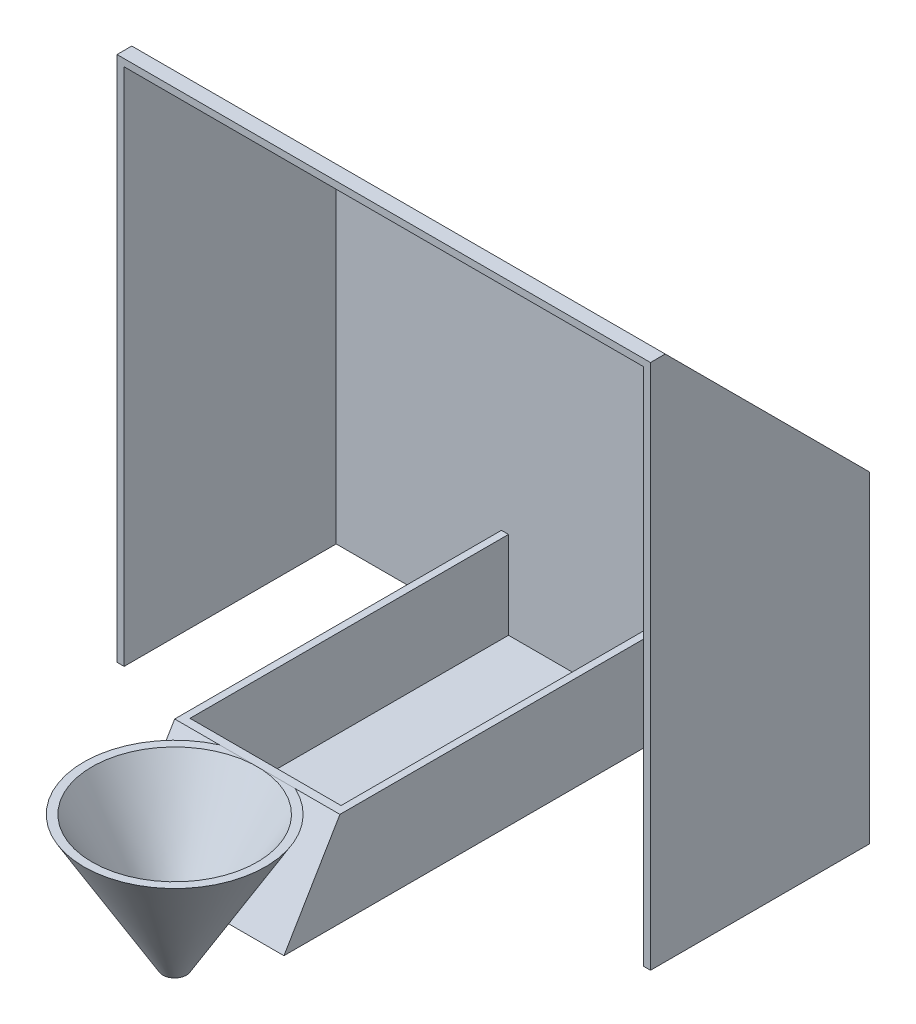
ISO-10303-21;
HEADER;
FILE_DESCRIPTION(('STEP AP214'),'2;1');
FILE_NAME('part.step','',(''),(''),'','','');
FILE_SCHEMA(('AUTOMOTIVE_DESIGN { 1 0 10303 214 1 1 1 1 }'));
ENDSEC;
DATA;
#1=APPLICATION_CONTEXT('core data for automotive mechanical design processes');
#2=APPLICATION_PROTOCOL_DEFINITION('international standard','automotive_design',2000,#1);
#3=PRODUCT_CONTEXT('',#1,'mechanical');
#4=PRODUCT('Part','Part','',(#3));
#5=PRODUCT_RELATED_PRODUCT_CATEGORY('part','',(#4));
#6=PRODUCT_DEFINITION_FORMATION('','',#4);
#7=PRODUCT_DEFINITION_CONTEXT('part definition',#1,'design');
#8=PRODUCT_DEFINITION('design','',#6,#7);
#9=PRODUCT_DEFINITION_SHAPE('','',#8);
#10=(LENGTH_UNIT() NAMED_UNIT(*) SI_UNIT(.MILLI.,.METRE.));
#11=(NAMED_UNIT(*) PLANE_ANGLE_UNIT() SI_UNIT($,.RADIAN.));
#12=(NAMED_UNIT(*) SI_UNIT($,.STERADIAN.) SOLID_ANGLE_UNIT());
#13=UNCERTAINTY_MEASURE_WITH_UNIT(LENGTH_MEASURE(1.E-05),#10,'distance_accuracy_value','');
#14=(GEOMETRIC_REPRESENTATION_CONTEXT(3) GLOBAL_UNCERTAINTY_ASSIGNED_CONTEXT((#13)) GLOBAL_UNIT_ASSIGNED_CONTEXT((#10,
#11,#12)) REPRESENTATION_CONTEXT('',''));
#15=CARTESIAN_POINT('',(0.,0.,0.));
#16=DIRECTION('',(0.,0.,1.));
#17=DIRECTION('',(1.,0.,0.));
#18=AXIS2_PLACEMENT_3D('',#15,#16,#17);
#19=CARTESIAN_POINT('',(105.,-240.579638163115,83.5749702421913));
#20=DIRECTION('',(0.,1.,0.));
#21=DIRECTION('',(0.,0.,1.));
#22=AXIS2_PLACEMENT_3D('',#19,#20,#21);
#23=CONICAL_SURFACE('',#22,2.58073250701614,0.535047974324398);
#24=CARTESIAN_POINT('',(105.,-180.,83.5749702421913));
#25=DIRECTION('',(0.,1.,0.));
#26=DIRECTION('',(0.,0.,1.));
#27=AXIS2_PLACEMENT_3D('',#24,#25,#26);
#28=CIRCLE('',#27,38.4873819644353);
#29=CARTESIAN_POINT('',(105.,-180.,122.062352206627));
#30=VERTEX_POINT('',#29);
#31=EDGE_CURVE('E11',#30,#30,#28,.F.);
#32=CARTESIAN_POINT('',(105.,-236.49798889872,83.5749702421913));
#33=DIRECTION('',(0.,1.,0.));
#34=DIRECTION('',(0.,0.,1.));
#35=AXIS2_PLACEMENT_3D('',#32,#33,#34);
#36=CIRCLE('',#35,5.00000000000001);
#37=CARTESIAN_POINT('',(105.,-236.49798889872,88.5749702421913));
#38=VERTEX_POINT('',#37);
#39=EDGE_CURVE('E62',#38,#38,#36,.T.);
#40=CARTESIAN_POINT('',(105.,-180.,122.062352206627));
#41=CARTESIAN_POINT('',(105.,-180.588520717695,121.713525311164));
#42=CARTESIAN_POINT('',(105.,-181.17704143539,121.364698415701));
#43=CARTESIAN_POINT('',(105.,-182.35408287078,120.667044624775));
#44=CARTESIAN_POINT('',(105.,-182.942603588475,120.318217729312));
#45=CARTESIAN_POINT('',(105.,-184.119645023865,119.620563938386));
#46=CARTESIAN_POINT('',(105.,-184.70816574156,119.271737042924));
#47=CARTESIAN_POINT('',(105.,-185.88520717695,118.574083251998));
#48=CARTESIAN_POINT('',(105.,-186.473727894645,118.225256356535));
#49=CARTESIAN_POINT('',(105.,-187.650769330035,117.527602565609));
#50=CARTESIAN_POINT('',(105.,-188.23929004773,117.178775670146));
#51=CARTESIAN_POINT('',(105.,-189.41633148312,116.481121879221));
#52=CARTESIAN_POINT('',(105.,-190.004852200815,116.132294983758));
#53=CARTESIAN_POINT('',(105.,-191.181893636205,115.434641192832));
#54=CARTESIAN_POINT('',(105.,-191.7704143539,115.085814297369));
#55=CARTESIAN_POINT('',(105.,-192.94745578929,114.388160506443));
#56=CARTESIAN_POINT('',(105.,-193.535976506985,114.039333610981));
#57=CARTESIAN_POINT('',(105.,-194.713017942375,113.341679820055));
#58=CARTESIAN_POINT('',(105.,-195.30153866007,112.992852924592));
#59=CARTESIAN_POINT('',(105.,-196.47858009546,112.295199133666));
#60=CARTESIAN_POINT('',(105.,-197.067100813155,111.946372238203));
#61=CARTESIAN_POINT('',(105.,-198.244142248545,111.248718447278));
#62=CARTESIAN_POINT('',(105.,-198.83266296624,110.899891551815));
#63=CARTESIAN_POINT('',(105.,-200.00970440163,110.202237760889));
#64=CARTESIAN_POINT('',(105.,-200.598225119325,109.853410865426));
#65=CARTESIAN_POINT('',(105.,-201.775266554715,109.1557570745));
#66=CARTESIAN_POINT('',(105.,-202.36378727241,108.806930179038));
#67=CARTESIAN_POINT('',(105.,-203.5408287078,108.109276388112));
#68=CARTESIAN_POINT('',(105.,-204.129349425495,107.760449492649));
#69=CARTESIAN_POINT('',(105.,-205.306390860885,107.062795701723));
#70=CARTESIAN_POINT('',(105.,-205.89491157858,106.71396880626));
#71=CARTESIAN_POINT('',(105.,-207.07195301397,106.016315015335));
#72=CARTESIAN_POINT('',(105.,-207.660473731665,105.667488119872));
#73=CARTESIAN_POINT('',(105.,-208.837515167055,104.969834328946));
#74=CARTESIAN_POINT('',(105.,-209.42603588475,104.621007433483));
#75=CARTESIAN_POINT('',(105.,-210.60307732014,103.923353642557));
#76=CARTESIAN_POINT('',(105.,-211.191598037835,103.574526747095));
#77=CARTESIAN_POINT('',(105.,-212.368639473225,102.876872956169));
#78=CARTESIAN_POINT('',(105.,-212.95716019092,102.528046060706));
#79=CARTESIAN_POINT('',(105.,-214.13420162631,101.83039226978));
#80=CARTESIAN_POINT('',(105.,-214.722722344005,101.481565374317));
#81=CARTESIAN_POINT('',(105.,-215.899763779395,100.783911583392));
#82=CARTESIAN_POINT('',(105.,-216.48828449709,100.435084687929));
#83=CARTESIAN_POINT('',(105.,-217.66532593248,99.737430897003));
#84=CARTESIAN_POINT('',(105.,-218.253846650175,99.3886040015402));
#85=CARTESIAN_POINT('',(105.,-219.430888085565,98.6909502106144));
#86=CARTESIAN_POINT('',(105.,-220.01940880326,98.3421233151516));
#87=CARTESIAN_POINT('',(105.,-221.19645023865,97.6444695242258));
#88=CARTESIAN_POINT('',(105.,-221.784970956345,97.295642628763));
#89=CARTESIAN_POINT('',(105.,-222.962012391735,96.5979888378372));
#90=CARTESIAN_POINT('',(105.,-223.55053310943,96.2491619423744));
#91=CARTESIAN_POINT('',(105.,-224.72757454482,95.5515081514486));
#92=CARTESIAN_POINT('',(105.,-225.316095262515,95.2026812559858));
#93=CARTESIAN_POINT('',(105.,-226.493136697905,94.50502746506));
#94=CARTESIAN_POINT('',(105.,-227.0816574156,94.1562005695972));
#95=CARTESIAN_POINT('',(105.,-228.25869885099,93.4585467786714));
#96=CARTESIAN_POINT('',(105.,-228.847219568685,93.1097198832086));
#97=CARTESIAN_POINT('',(105.,-230.024261004075,92.4120660922828));
#98=CARTESIAN_POINT('',(105.,-230.61278172177,92.0632391968199));
#99=CARTESIAN_POINT('',(105.,-231.78982315716,91.3655854058942));
#100=CARTESIAN_POINT('',(105.,-232.378343874855,91.0167585104314));
#101=CARTESIAN_POINT('',(105.,-233.555385310245,90.3191047195056));
#102=CARTESIAN_POINT('',(105.,-234.14390602794,89.9702778240428));
#103=CARTESIAN_POINT('',(105.,-235.32094746333,89.272624033117));
#104=CARTESIAN_POINT('',(105.,-235.909468181025,88.9237971376541));
#105=CARTESIAN_POINT('',(105.,-236.49798889872,88.5749702421913));
#106=B_SPLINE_CURVE_WITH_KNOTS('',3,(#40,#41,#42,#43,#44,#45,#46,#47,#48,#49,#50,#51,#52,#53,
#54,#55,#56,#57,#58,#59,#60,#61,#62,#63,#64,#65,#66,#67,#68,#69,#70,#71,#72,#73,#74,#75,#76,#77,
#78,#79,#80,#81,#82,#83,#84,#85,#86,#87,#88,#89,#90,#91,#92,#93,#94,#95,#96,#97,#98,#99,#100,
#101,#102,#103,#104,#105),.UNSPECIFIED.,.F.,.F.,(4,2,2,2,2,2,2,2,2,2,2,2,2,2,2,2,2,2,2,2,2,2,2,
2,2,2,2,2,2,2,2,2,4),(0.,2.05239653658609,4.10479307317217,6.15718960975826,8.20958614634434,
10.2619826829304,12.3143792195165,14.3667757561026,16.4191722926886,18.4715688292747,
20.5239653658608,22.5763619024469,24.628758439033,26.681154975619,28.7335515122051,
30.7859480487912,32.8383445853772,34.8907411219633,36.9431376585494,38.9955341951355,
41.0479307317216,43.1003272683077,45.1527238048937,47.2051203414798,49.2575168780659,
51.309913414652,53.3623099512381,55.4147064878241,57.4671030244102,59.5194995609963,
61.5718960975824,63.6242926341685,65.6766891707545),.UNSPECIFIED.);
#107=EDGE_CURVE('BSEAM51',#30,#38,#106,.T.);
#108=ORIENTED_EDGE('',*,*,#31,.T.);
#109=ORIENTED_EDGE('',*,*,#39,.T.);
#110=ORIENTED_EDGE('',*,*,#107,.T.);
#111=ORIENTED_EDGE('',*,*,#107,.F.);
#112=EDGE_LOOP('',(#108,#110,#109,#111));
#113=FACE_BOUND('',#112,.T.);
#114=ADVANCED_FACE('F51',(#113),#23,.T.);
#115=CARTESIAN_POINT('',(105.,-239.04999123417,83.5749702421913));
#116=DIRECTION('',(0.,1.,0.));
#117=DIRECTION('',(0.,0.,1.));
#118=AXIS2_PLACEMENT_3D('',#115,#116,#117);
#119=CONICAL_SURFACE('',#118,0.,0.535047974324398);
#120=CARTESIAN_POINT('',(105.,-180.,83.5749702421913));
#121=DIRECTION('',(0.,-1.,0.));
#122=DIRECTION('',(0.,0.,-1.));
#123=AXIS2_PLACEMENT_3D('',#120,#121,#122);
#124=CIRCLE('',#123,35.);
#125=CARTESIAN_POINT('',(105.,-180.,118.574970242191));
#126=VERTEX_POINT('',#125);
#127=EDGE_CURVE('E58',#126,#126,#124,.T.);
#128=CARTESIAN_POINT('',(105.,-230.614278200717,83.5749702421913));
#129=DIRECTION('',(0.,1.,0.));
#130=DIRECTION('',(0.,0.,1.));
#131=AXIS2_PLACEMENT_3D('',#128,#129,#130);
#132=CIRCLE('',#131,5.00000000000001);
#133=CARTESIAN_POINT('',(105.,-230.614278200717,88.5749702421913));
#134=VERTEX_POINT('',#133);
#135=EDGE_CURVE('E54',#134,#134,#132,.T.);
#136=CARTESIAN_POINT('',(105.,-180.,118.574970242191));
#137=CARTESIAN_POINT('',(105.,-180.527232064591,118.262470242191));
#138=CARTESIAN_POINT('',(105.,-181.054464129182,117.949970242191));
#139=CARTESIAN_POINT('',(105.,-182.108928258363,117.324970242191));
#140=CARTESIAN_POINT('',(105.,-182.636160322954,117.012470242191));
#141=CARTESIAN_POINT('',(105.,-183.690624452136,116.387470242191));
#142=CARTESIAN_POINT('',(105.,-184.217856516726,116.074970242191));
#143=CARTESIAN_POINT('',(105.,-185.272320645908,115.449970242191));
#144=CARTESIAN_POINT('',(105.,-185.799552710499,115.137470242191));
#145=CARTESIAN_POINT('',(105.,-186.85401683968,114.512470242191));
#146=CARTESIAN_POINT('',(105.,-187.381248904271,114.199970242191));
#147=CARTESIAN_POINT('',(105.,-188.435713033453,113.574970242191));
#148=CARTESIAN_POINT('',(105.,-188.962945098044,113.262470242191));
#149=CARTESIAN_POINT('',(105.,-190.017409227225,112.637470242191));
#150=CARTESIAN_POINT('',(105.,-190.544641291816,112.324970242191));
#151=CARTESIAN_POINT('',(105.,-191.599105420998,111.699970242191));
#152=CARTESIAN_POINT('',(105.,-192.126337485588,111.387470242191));
#153=CARTESIAN_POINT('',(105.,-193.18080161477,110.762470242191));
#154=CARTESIAN_POINT('',(105.,-193.708033679361,110.449970242191));
#155=CARTESIAN_POINT('',(105.,-194.762497808542,109.824970242191));
#156=CARTESIAN_POINT('',(105.,-195.289729873133,109.512470242191));
#157=CARTESIAN_POINT('',(105.,-196.344194002315,108.887470242191));
#158=CARTESIAN_POINT('',(105.,-196.871426066906,108.574970242191));
#159=CARTESIAN_POINT('',(105.,-197.925890196087,107.949970242191));
#160=CARTESIAN_POINT('',(105.,-198.453122260678,107.637470242191));
#161=CARTESIAN_POINT('',(105.,-199.50758638986,107.012470242191));
#162=CARTESIAN_POINT('',(105.,-200.034818454451,106.699970242191));
#163=CARTESIAN_POINT('',(105.,-201.089282583632,106.074970242191));
#164=CARTESIAN_POINT('',(105.,-201.616514648223,105.762470242191));
#165=CARTESIAN_POINT('',(105.,-202.670978777405,105.137470242191));
#166=CARTESIAN_POINT('',(105.,-203.198210841995,104.824970242191));
#167=CARTESIAN_POINT('',(105.,-204.252674971177,104.199970242191));
#168=CARTESIAN_POINT('',(105.,-204.779907035768,103.887470242191));
#169=CARTESIAN_POINT('',(105.,-205.834371164949,103.262470242191));
#170=CARTESIAN_POINT('',(105.,-206.36160322954,102.949970242191));
#171=CARTESIAN_POINT('',(105.,-207.416067358722,102.324970242191));
#172=CARTESIAN_POINT('',(105.,-207.943299423313,102.012470242191));
#173=CARTESIAN_POINT('',(105.,-208.997763552494,101.387470242191));
#174=CARTESIAN_POINT('',(105.,-209.524995617085,101.074970242191));
#175=CARTESIAN_POINT('',(105.,-210.579459746267,100.449970242191));
#176=CARTESIAN_POINT('',(105.,-211.106691810857,100.137470242191));
#177=CARTESIAN_POINT('',(105.,-212.161155940039,99.5124702421913));
#178=CARTESIAN_POINT('',(105.,-212.68838800463,99.1999702421913));
#179=CARTESIAN_POINT('',(105.,-213.742852133811,98.5749702421913));
#180=CARTESIAN_POINT('',(105.,-214.270084198402,98.2624702421913));
#181=CARTESIAN_POINT('',(105.,-215.324548327584,97.6374702421913));
#182=CARTESIAN_POINT('',(105.,-215.851780392175,97.3249702421913));
#183=CARTESIAN_POINT('',(105.,-216.906244521356,96.6999702421913));
#184=CARTESIAN_POINT('',(105.,-217.433476585947,96.3874702421913));
#185=CARTESIAN_POINT('',(105.,-218.487940715129,95.7624702421913));
#186=CARTESIAN_POINT('',(105.,-219.015172779719,95.4499702421913));
#187=CARTESIAN_POINT('',(105.,-220.069636908901,94.8249702421913));
#188=CARTESIAN_POINT('',(105.,-220.596868973492,94.5124702421913));
#189=CARTESIAN_POINT('',(105.,-221.651333102674,93.8874702421913));
#190=CARTESIAN_POINT('',(105.,-222.178565167264,93.5749702421913));
#191=CARTESIAN_POINT('',(105.,-223.233029296446,92.9499702421913));
#192=CARTESIAN_POINT('',(105.,-223.760261361037,92.6374702421913));
#193=CARTESIAN_POINT('',(105.,-224.814725490218,92.0124702421913));
#194=CARTESIAN_POINT('',(105.,-225.341957554809,91.6999702421913));
#195=CARTESIAN_POINT('',(105.,-226.396421683991,91.0749702421913));
#196=CARTESIAN_POINT('',(105.,-226.923653748582,90.7624702421913));
#197=CARTESIAN_POINT('',(105.,-227.978117877763,90.1374702421913));
#198=CARTESIAN_POINT('',(105.,-228.505349942354,89.8249702421913));
#199=CARTESIAN_POINT('',(105.,-229.559814071536,89.1999702421913));
#200=CARTESIAN_POINT('',(105.,-230.087046136126,88.8874702421913));
#201=CARTESIAN_POINT('',(105.,-230.614278200717,88.5749702421913));
#202=B_SPLINE_CURVE_WITH_KNOTS('',3,(#136,#137,#138,#139,#140,#141,#142,#143,#144,#145,#146,
#147,#148,#149,#150,#151,#152,#153,#154,#155,#156,#157,#158,#159,#160,#161,#162,#163,#164,#165,
#166,#167,#168,#169,#170,#171,#172,#173,#174,#175,#176,#177,#178,#179,#180,#181,#182,#183,#184,
#185,#186,#187,#188,#189,#190,#191,#192,#193,#194,#195,#196,#197,#198,#199,#200,#201),
.UNSPECIFIED.,.F.,.F.,(4,2,2,2,2,2,2,2,2,2,2,2,2,2,2,2,2,2,2,2,2,2,2,2,2,2,2,2,2,2,2,2,4),(0.,
1.83865959312596,3.67731918625192,5.51597877937788,7.35463837250385,9.19329796562981,
11.0319575587558,12.8706171518817,14.7092767450077,16.5479363381337,18.3865959312596,
20.2252555243856,22.0639151175116,23.9025747106375,25.7412343037635,27.5798938968895,
29.4185534900154,31.2572130831414,33.0958726762673,34.9345322693933,36.7731918625193,
38.6118514556452,40.4505110487712,42.2891706418972,44.1278302350231,45.9664898281491,
47.8051494212751,49.643809014401,51.482468607527,53.321128200653,55.1597877937789,
56.9984473869049,58.8371069800308),.UNSPECIFIED.);
#203=EDGE_CURVE('BSEAM73',#126,#134,#202,.T.);
#204=ORIENTED_EDGE('',*,*,#127,.F.);
#205=ORIENTED_EDGE('',*,*,#135,.F.);
#206=ORIENTED_EDGE('',*,*,#203,.T.);
#207=ORIENTED_EDGE('',*,*,#203,.F.);
#208=EDGE_LOOP('',(#204,#206,#205,#207));
#209=FACE_BOUND('',#208,.T.);
#210=ADVANCED_FACE('F73',(#209),#119,.F.);
#211=CARTESIAN_POINT('',(105.,-180.,48.5749702421913));
#212=DIRECTION('',(0.,1.,0.));
#213=DIRECTION('',(0.,0.,1.));
#214=AXIS2_PLACEMENT_3D('',#211,#212,#213);
#215=PLANE('',#214);
#216=ORIENTED_EDGE('',*,*,#127,.T.);
#217=EDGE_LOOP('',(#216));
#218=FACE_BOUND('',#217,.T.);
#219=ORIENTED_EDGE('',*,*,#31,.F.);
#220=EDGE_LOOP('',(#219));
#221=FACE_BOUND('',#220,.T.);
#222=ADVANCED_FACE('F75',(#218,#221),#215,.T.);
#223=CARTESIAN_POINT('',(105.,-230.,83.5749702421913));
#224=DIRECTION('',(0.,-1.,0.));
#225=DIRECTION('',(0.,0.,-1.));
#226=AXIS2_PLACEMENT_3D('',#223,#224,#225);
#227=CYLINDRICAL_SURFACE('',#226,5.00000000000001);
#228=ORIENTED_EDGE('',*,*,#39,.F.);
#229=EDGE_LOOP('',(#228));
#230=FACE_BOUND('',#229,.T.);
#231=ORIENTED_EDGE('',*,*,#135,.T.);
#232=EDGE_LOOP('',(#231));
#233=FACE_BOUND('',#232,.T.);
#234=ADVANCED_FACE('F71',(#230,#233),#227,.F.);
#235=CLOSED_SHELL('',(#114,#210,#222,#234));
#236=MANIFOLD_SOLID_BREP('B2',#235);
#237=CARTESIAN_POINT('',(140.,-180.,48.5749702421913));
#238=DIRECTION('',(0.,-1.,0.));
#239=DIRECTION('',(0.,0.,-1.));
#240=AXIS2_PLACEMENT_3D('',#237,#238,#239);
#241=PLANE('',#240);
#242=DIRECTION('',(0.,0.,1.));
#243=VECTOR('',#242,1.);
#244=CARTESIAN_POINT('',(73.,-180.,0.));
#245=LINE('',#244,#243);
#246=CARTESIAN_POINT('',(73.,-180.,-89.8528137423856));
#247=VERTEX_POINT('',#246);
#248=CARTESIAN_POINT('',(73.,-180.,45.087588277756));
#249=VERTEX_POINT('',#248);
#250=EDGE_CURVE('E258',#247,#249,#245,.T.);
#251=ORIENTED_EDGE('',*,*,#250,.F.);
#252=DIRECTION('',(1.,0.,0.));
#253=VECTOR('',#252,1.);
#254=CARTESIAN_POINT('',(220.,-180.,-89.8528137423856));
#255=LINE('',#254,#253);
#256=CARTESIAN_POINT('',(70.,-180.,-89.8528137423856));
#257=VERTEX_POINT('',#256);
#258=EDGE_CURVE('E135',#257,#247,#255,.T.);
#259=ORIENTED_EDGE('',*,*,#258,.F.);
#260=DIRECTION('',(0.,0.,1.));
#261=VECTOR('',#260,1.);
#262=CARTESIAN_POINT('',(70.,-180.,48.5749702421913));
#263=LINE('',#262,#261);
#264=CARTESIAN_POINT('',(70.,-180.,48.5749702421913));
#265=VERTEX_POINT('',#264);
#266=EDGE_CURVE('E286',#257,#265,#263,.T.);
#267=ORIENTED_EDGE('',*,*,#266,.T.);
#268=DIRECTION('',(-1.,0.,0.));
#269=VECTOR('',#268,1.);
#270=CARTESIAN_POINT('',(140.,-180.,48.5749702421913));
#271=LINE('',#270,#269);
#272=CARTESIAN_POINT('',(140.,-180.,48.5749702421913));
#273=VERTEX_POINT('',#272);
#274=EDGE_CURVE('E303',#273,#265,#271,.T.);
#275=ORIENTED_EDGE('',*,*,#274,.F.);
#276=DIRECTION('',(0.,0.,1.));
#277=VECTOR('',#276,1.);
#278=CARTESIAN_POINT('',(140.,-180.,48.5749702421913));
#279=LINE('',#278,#277);
#280=CARTESIAN_POINT('',(140.,-180.,-89.8528137423856));
#281=VERTEX_POINT('',#280);
#282=EDGE_CURVE('E287',#281,#273,#279,.T.);
#283=ORIENTED_EDGE('',*,*,#282,.F.);
#284=CARTESIAN_POINT('',(137.,-180.,-89.8528137423856));
#285=VERTEX_POINT('',#284);
#286=EDGE_CURVE('E149',#285,#281,#255,.T.);
#287=ORIENTED_EDGE('',*,*,#286,.F.);
#288=DIRECTION('',(0.,0.,1.));
#289=VECTOR('',#288,1.);
#290=CARTESIAN_POINT('',(137.,-180.,0.));
#291=LINE('',#290,#289);
#292=CARTESIAN_POINT('',(137.,-180.,45.087588277756));
#293=VERTEX_POINT('',#292);
#294=EDGE_CURVE('E272',#285,#293,#291,.T.);
#295=ORIENTED_EDGE('',*,*,#294,.T.);
#296=DIRECTION('',(-1.,0.,0.));
#297=VECTOR('',#296,1.);
#298=CARTESIAN_POINT('',(140.,-180.,45.087588277756));
#299=LINE('',#298,#297);
#300=EDGE_CURVE('E142',#293,#249,#299,.T.);
#301=ORIENTED_EDGE('',*,*,#300,.T.);
#302=EDGE_LOOP('',(#251,#259,#267,#275,#283,#287,#295,#301));
#303=FACE_BOUND('',#302,.T.);
#304=ADVANCED_FACE('F127',(#303),#241,.F.);
#305=CARTESIAN_POINT('',(220.,-220.,-89.8528137423856));
#306=DIRECTION('',(0.,0.,1.));
#307=DIRECTION('',(1.,0.,0.));
#308=AXIS2_PLACEMENT_3D('',#305,#306,#307);
#309=PLANE('',#308);
#310=ORIENTED_EDGE('',*,*,#258,.T.);
#311=DIRECTION('',(0.,-1.,0.));
#312=VECTOR('',#311,1.);
#313=CARTESIAN_POINT('',(73.,-220.,-89.8528137423856));
#314=LINE('',#313,#312);
#315=CARTESIAN_POINT('',(73.,-217.,-89.8528137423856));
#316=VERTEX_POINT('',#315);
#317=EDGE_CURVE('E284',#247,#316,#314,.T.);
#318=ORIENTED_EDGE('',*,*,#317,.T.);
#319=DIRECTION('',(-1.,0.,0.));
#320=VECTOR('',#319,1.);
#321=CARTESIAN_POINT('',(220.,-217.,-89.8528137423856));
#322=LINE('',#321,#320);
#323=CARTESIAN_POINT('',(137.,-217.,-89.8528137423856));
#324=VERTEX_POINT('',#323);
#325=EDGE_CURVE('E271',#324,#316,#322,.T.);
#326=ORIENTED_EDGE('',*,*,#325,.F.);
#327=DIRECTION('',(0.,1.,0.));
#328=VECTOR('',#327,1.);
#329=CARTESIAN_POINT('',(137.,0.,-89.8528137423856));
#330=LINE('',#329,#328);
#331=EDGE_CURVE('E282',#324,#285,#330,.T.);
#332=ORIENTED_EDGE('',*,*,#331,.T.);
#333=ORIENTED_EDGE('',*,*,#286,.T.);
#334=DIRECTION('',(0.,-1.,0.));
#335=VECTOR('',#334,1.);
#336=CARTESIAN_POINT('',(140.,-220.,-89.8528137423856));
#337=LINE('',#336,#335);
#338=CARTESIAN_POINT('',(140.,-220.,-89.8528137423856));
#339=VERTEX_POINT('',#338);
#340=EDGE_CURVE('E49',#281,#339,#337,.T.);
#341=ORIENTED_EDGE('',*,*,#340,.T.);
#342=DIRECTION('',(-1.,0.,0.));
#343=VECTOR('',#342,1.);
#344=CARTESIAN_POINT('',(220.,-220.,-89.8528137423856));
#345=LINE('',#344,#343);
#346=CARTESIAN_POINT('',(220.,-220.,-89.8528137423856));
#347=VERTEX_POINT('',#346);
#348=EDGE_CURVE('E341',#347,#339,#345,.T.);
#349=ORIENTED_EDGE('',*,*,#348,.F.);
#350=DIRECTION('',(0.,1.,0.));
#351=VECTOR('',#350,1.);
#352=CARTESIAN_POINT('',(220.,-220.,-89.8528137423856));
#353=LINE('',#352,#351);
#354=CARTESIAN_POINT('',(220.,-84.8528137423859,-89.8528137423856));
#355=VERTEX_POINT('',#354);
#356=EDGE_CURVE('E310',#347,#355,#353,.T.);
#357=ORIENTED_EDGE('',*,*,#356,.T.);
#358=DIRECTION('',(-1.,0.,0.));
#359=VECTOR('',#358,1.);
#360=CARTESIAN_POINT('',(220.,-84.8528137423859,-89.8528137423856));
#361=LINE('',#360,#359);
#362=CARTESIAN_POINT('',(0.,-84.8528137423859,-89.8528137423856));
#363=VERTEX_POINT('',#362);
#364=EDGE_CURVE('E338',#355,#363,#361,.T.);
#365=ORIENTED_EDGE('',*,*,#364,.T.);
#366=DIRECTION('',(0.,1.,0.));
#367=VECTOR('',#366,1.);
#368=CARTESIAN_POINT('',(0.,-220.,-89.8528137423856));
#369=LINE('',#368,#367);
#370=CARTESIAN_POINT('',(0.,-220.,-89.8528137423856));
#371=VERTEX_POINT('',#370);
#372=EDGE_CURVE('E325',#371,#363,#369,.T.);
#373=ORIENTED_EDGE('',*,*,#372,.F.);
#374=CARTESIAN_POINT('',(70.,-220.,-89.8528137423856));
#375=VERTEX_POINT('',#374);
#376=EDGE_CURVE('E340',#375,#371,#345,.T.);
#377=ORIENTED_EDGE('',*,*,#376,.F.);
#378=DIRECTION('',(0.,-1.,0.));
#379=VECTOR('',#378,1.);
#380=CARTESIAN_POINT('',(70.,-220.,-89.8528137423856));
#381=LINE('',#380,#379);
#382=EDGE_CURVE('E376',#257,#375,#381,.T.);
#383=ORIENTED_EDGE('',*,*,#382,.F.);
#384=EDGE_LOOP('',(#310,#318,#326,#332,#333,#341,#349,#357,#365,#373,#377,#383));
#385=FACE_BOUND('',#384,.T.);
#386=ADVANCED_FACE('F388',(#385),#309,.T.);
#387=CARTESIAN_POINT('',(220.,-220.,0.));
#388=DIRECTION('',(0.,1.,0.));
#389=DIRECTION('',(0.,0.,1.));
#390=AXIS2_PLACEMENT_3D('',#387,#388,#389);
#391=PLANE('',#390);
#392=CARTESIAN_POINT('',(105.,-220.,36.7021527435766));
#393=DIRECTION('',(0.,1.,0.));
#394=DIRECTION('',(0.,0.,1.));
#395=AXIS2_PLACEMENT_3D('',#392,#393,#394);
#396=CIRCLE('',#395,3.6);
#397=CARTESIAN_POINT('',(105.,-220.,40.3021527435766));
#398=VERTEX_POINT('',#397);
#399=EDGE_CURVE('E280',#398,#398,#396,.T.);
#400=ORIENTED_EDGE('',*,*,#399,.T.);
#401=EDGE_LOOP('',(#400));
#402=FACE_BOUND('',#401,.T.);
#403=CARTESIAN_POINT('',(105.,-220.,0.302152743576589));
#404=DIRECTION('',(0.,1.,0.));
#405=DIRECTION('',(0.,0.,1.));
#406=AXIS2_PLACEMENT_3D('',#403,#404,#405);
#407=CIRCLE('',#406,3.6);
#408=CARTESIAN_POINT('',(105.,-220.,3.90215274357659));
#409=VERTEX_POINT('',#408);
#410=EDGE_CURVE('E484',#409,#409,#407,.T.);
#411=ORIENTED_EDGE('',*,*,#410,.T.);
#412=EDGE_LOOP('',(#411));
#413=FACE_BOUND('',#412,.T.);
#414=DIRECTION('',(0.,0.,-1.));
#415=VECTOR('',#414,1.);
#416=CARTESIAN_POINT('',(-3.,-220.,0.));
#417=LINE('',#416,#415);
#418=CARTESIAN_POINT('',(-3.,-220.,0.));
#419=VERTEX_POINT('',#418);
#420=CARTESIAN_POINT('',(-3.,-220.,-92.8528137423856));
#421=VERTEX_POINT('',#420);
#422=EDGE_CURVE('E344',#419,#421,#417,.T.);
#423=ORIENTED_EDGE('',*,*,#422,.T.);
#424=DIRECTION('',(-1.,0.,0.));
#425=VECTOR('',#424,1.);
#426=CARTESIAN_POINT('',(220.,-220.,-92.8528137423856));
#427=LINE('',#426,#425);
#428=CARTESIAN_POINT('',(223.,-220.,-92.8528137423856));
#429=VERTEX_POINT('',#428);
#430=EDGE_CURVE('E356',#429,#421,#427,.T.);
#431=ORIENTED_EDGE('',*,*,#430,.F.);
#432=DIRECTION('',(0.,0.,-1.));
#433=VECTOR('',#432,1.);
#434=CARTESIAN_POINT('',(223.,-220.,0.));
#435=LINE('',#434,#433);
#436=CARTESIAN_POINT('',(223.,-220.,0.));
#437=VERTEX_POINT('',#436);
#438=EDGE_CURVE('E361',#437,#429,#435,.T.);
#439=ORIENTED_EDGE('',*,*,#438,.F.);
#440=DIRECTION('',(-1.,0.,0.));
#441=VECTOR('',#440,1.);
#442=CARTESIAN_POINT('',(220.,-220.,0.));
#443=LINE('',#442,#441);
#444=CARTESIAN_POINT('',(220.,-220.,0.));
#445=VERTEX_POINT('',#444);
#446=EDGE_CURVE('E345',#437,#445,#443,.T.);
#447=ORIENTED_EDGE('',*,*,#446,.T.);
#448=DIRECTION('',(0.,0.,-1.));
#449=VECTOR('',#448,1.);
#450=CARTESIAN_POINT('',(220.,-220.,0.));
#451=LINE('',#450,#449);
#452=EDGE_CURVE('E307',#445,#347,#451,.T.);
#453=ORIENTED_EDGE('',*,*,#452,.T.);
#454=ORIENTED_EDGE('',*,*,#348,.T.);
#455=DIRECTION('',(0.,0.,-1.));
#456=VECTOR('',#455,1.);
#457=CARTESIAN_POINT('',(140.,-220.,-92.8528137423856));
#458=LINE('',#457,#456);
#459=CARTESIAN_POINT('',(140.,-220.,72.2836951842175));
#460=VERTEX_POINT('',#459);
#461=EDGE_CURVE('E292',#460,#339,#458,.T.);
#462=ORIENTED_EDGE('',*,*,#461,.F.);
#463=DIRECTION('',(-1.,0.,0.));
#464=VECTOR('',#463,1.);
#465=CARTESIAN_POINT('',(140.,-220.,72.2836951842175));
#466=LINE('',#465,#464);
#467=CARTESIAN_POINT('',(70.,-220.,72.2836951842175));
#468=VERTEX_POINT('',#467);
#469=EDGE_CURVE('E295',#460,#468,#466,.T.);
#470=ORIENTED_EDGE('',*,*,#469,.T.);
#471=DIRECTION('',(0.,0.,-1.));
#472=VECTOR('',#471,1.);
#473=CARTESIAN_POINT('',(70.,-220.,-92.8528137423856));
#474=LINE('',#473,#472);
#475=EDGE_CURVE('E290',#468,#375,#474,.T.);
#476=ORIENTED_EDGE('',*,*,#475,.T.);
#477=ORIENTED_EDGE('',*,*,#376,.T.);
#478=DIRECTION('',(0.,0.,-1.));
#479=VECTOR('',#478,1.);
#480=CARTESIAN_POINT('',(0.,-220.,0.));
#481=LINE('',#480,#479);
#482=CARTESIAN_POINT('',(0.,-220.,0.));
#483=VERTEX_POINT('',#482);
#484=EDGE_CURVE('E306',#483,#371,#481,.T.);
#485=ORIENTED_EDGE('',*,*,#484,.F.);
#486=EDGE_CURVE('E349',#483,#419,#443,.T.);
#487=ORIENTED_EDGE('',*,*,#486,.T.);
#488=EDGE_LOOP('',(#423,#431,#439,#447,#453,#454,#462,#470,#476,#477,#485,#487));
#489=FACE_BOUND('',#488,.T.);
#490=ADVANCED_FACE('F406',(#402,#413,#489),#391,.F.);
#491=CARTESIAN_POINT('',(220.,0.,0.));
#492=DIRECTION('',(0.,0.,-1.));
#493=DIRECTION('',(0.,1.,0.));
#494=AXIS2_PLACEMENT_3D('',#491,#492,#493);
#495=PLANE('',#494);
#496=DIRECTION('',(0.,-1.,0.));
#497=VECTOR('',#496,1.);
#498=CARTESIAN_POINT('',(0.,0.,0.));
#499=LINE('',#498,#497);
#500=CARTESIAN_POINT('',(0.,0.,0.));
#501=VERTEX_POINT('',#500);
#502=EDGE_CURVE('E311',#501,#483,#499,.T.);
#503=ORIENTED_EDGE('',*,*,#502,.F.);
#504=DIRECTION('',(-1.,0.,0.));
#505=VECTOR('',#504,1.);
#506=CARTESIAN_POINT('',(220.,0.,0.));
#507=LINE('',#506,#505);
#508=CARTESIAN_POINT('',(220.,0.,0.));
#509=VERTEX_POINT('',#508);
#510=EDGE_CURVE('E322',#509,#501,#507,.T.);
#511=ORIENTED_EDGE('',*,*,#510,.F.);
#512=DIRECTION('',(0.,-1.,0.));
#513=VECTOR('',#512,1.);
#514=CARTESIAN_POINT('',(220.,0.,0.));
#515=LINE('',#514,#513);
#516=EDGE_CURVE('E319',#509,#445,#515,.T.);
#517=ORIENTED_EDGE('',*,*,#516,.T.);
#518=ORIENTED_EDGE('',*,*,#446,.F.);
#519=DIRECTION('',(0.,-1.,0.));
#520=VECTOR('',#519,1.);
#521=CARTESIAN_POINT('',(223.,0.,0.));
#522=LINE('',#521,#520);
#523=CARTESIAN_POINT('',(223.,3.,0.));
#524=VERTEX_POINT('',#523);
#525=EDGE_CURVE('E374',#524,#437,#522,.T.);
#526=ORIENTED_EDGE('',*,*,#525,.F.);
#527=DIRECTION('',(-1.,0.,0.));
#528=VECTOR('',#527,1.);
#529=CARTESIAN_POINT('',(220.,3.,0.));
#530=LINE('',#529,#528);
#531=CARTESIAN_POINT('',(-3.,3.,0.));
#532=VERTEX_POINT('',#531);
#533=EDGE_CURVE('E348',#524,#532,#530,.T.);
#534=ORIENTED_EDGE('',*,*,#533,.T.);
#535=DIRECTION('',(0.,-1.,0.));
#536=VECTOR('',#535,1.);
#537=CARTESIAN_POINT('',(-3.,0.,0.));
#538=LINE('',#537,#536);
#539=EDGE_CURVE('E371',#532,#419,#538,.T.);
#540=ORIENTED_EDGE('',*,*,#539,.T.);
#541=ORIENTED_EDGE('',*,*,#486,.F.);
#542=EDGE_LOOP('',(#503,#511,#517,#518,#526,#534,#540,#541));
#543=FACE_BOUND('',#542,.T.);
#544=ADVANCED_FACE('F415',(#543),#495,.F.);
#545=CARTESIAN_POINT('',(220.,-220.,-92.8528137423856));
#546=DIRECTION('',(0.,0.,1.));
#547=DIRECTION('',(1.,0.,0.));
#548=AXIS2_PLACEMENT_3D('',#545,#546,#547);
#549=PLANE('',#548);
#550=ORIENTED_EDGE('',*,*,#430,.T.);
#551=DIRECTION('',(0.,1.,0.));
#552=VECTOR('',#551,1.);
#553=CARTESIAN_POINT('',(-3.,-220.,-92.8528137423856));
#554=LINE('',#553,#552);
#555=CARTESIAN_POINT('',(-3.,-83.6101730552666,-92.8528137423856));
#556=VERTEX_POINT('',#555);
#557=EDGE_CURVE('E350',#421,#556,#554,.T.);
#558=ORIENTED_EDGE('',*,*,#557,.T.);
#559=DIRECTION('',(-1.,0.,0.));
#560=VECTOR('',#559,1.);
#561=CARTESIAN_POINT('',(220.,-83.6101730552666,-92.8528137423856));
#562=LINE('',#561,#560);
#563=CARTESIAN_POINT('',(223.,-83.6101730552666,-92.8528137423856));
#564=VERTEX_POINT('',#563);
#565=EDGE_CURVE('E354',#564,#556,#562,.T.);
#566=ORIENTED_EDGE('',*,*,#565,.F.);
#567=DIRECTION('',(0.,1.,0.));
#568=VECTOR('',#567,1.);
#569=CARTESIAN_POINT('',(223.,-220.,-92.8528137423856));
#570=LINE('',#569,#568);
#571=EDGE_CURVE('E358',#429,#564,#570,.T.);
#572=ORIENTED_EDGE('',*,*,#571,.F.);
#573=EDGE_LOOP('',(#550,#558,#566,#572));
#574=FACE_BOUND('',#573,.T.);
#575=ADVANCED_FACE('F437',(#574),#549,.F.);
#576=CARTESIAN_POINT('',(220.,2.12132034355964,-7.12132034355965));
#577=DIRECTION('',(0.,0.707106781186546,-0.707106781186549));
#578=DIRECTION('',(0.,0.707106781186549,0.707106781186546));
#579=AXIS2_PLACEMENT_3D('',#576,#577,#578);
#580=PLANE('',#579);
#581=DIRECTION('',(0.,-0.707106781186549,-0.707106781186546));
#582=VECTOR('',#581,1.);
#583=CARTESIAN_POINT('',(-3.,2.12132034355964,-7.12132034355965));
#584=LINE('',#583,#582);
#585=CARTESIAN_POINT('',(-3.,3.,-6.24264068711929));
#586=VERTEX_POINT('',#585);
#587=EDGE_CURVE('E353',#586,#556,#584,.T.);
#588=ORIENTED_EDGE('',*,*,#587,.F.);
#589=DIRECTION('',(-1.,0.,0.));
#590=VECTOR('',#589,1.);
#591=CARTESIAN_POINT('',(220.,3.,-6.24264068711929));
#592=LINE('',#591,#590);
#593=CARTESIAN_POINT('',(223.,3.,-6.24264068711929));
#594=VERTEX_POINT('',#593);
#595=EDGE_CURVE('E357',#594,#586,#592,.T.);
#596=ORIENTED_EDGE('',*,*,#595,.F.);
#597=DIRECTION('',(0.,-0.707106781186549,-0.707106781186546));
#598=VECTOR('',#597,1.);
#599=CARTESIAN_POINT('',(223.,2.12132034355964,-7.12132034355965));
#600=LINE('',#599,#598);
#601=EDGE_CURVE('E360',#594,#564,#600,.T.);
#602=ORIENTED_EDGE('',*,*,#601,.T.);
#603=ORIENTED_EDGE('',*,*,#565,.T.);
#604=EDGE_LOOP('',(#588,#596,#602,#603));
#605=FACE_BOUND('',#604,.T.);
#606=ADVANCED_FACE('F447',(#605),#580,.T.);
#607=CARTESIAN_POINT('',(220.,3.,0.));
#608=DIRECTION('',(0.,1.,0.));
#609=DIRECTION('',(0.,0.,1.));
#610=AXIS2_PLACEMENT_3D('',#607,#608,#609);
#611=PLANE('',#610);
#612=DIRECTION('',(0.,0.,-1.));
#613=VECTOR('',#612,1.);
#614=CARTESIAN_POINT('',(-3.,3.,0.));
#615=LINE('',#614,#613);
#616=EDGE_CURVE('E364',#532,#586,#615,.T.);
#617=ORIENTED_EDGE('',*,*,#616,.F.);
#618=ORIENTED_EDGE('',*,*,#533,.F.);
#619=DIRECTION('',(0.,0.,-1.));
#620=VECTOR('',#619,1.);
#621=CARTESIAN_POINT('',(223.,3.,0.));
#622=LINE('',#621,#620);
#623=EDGE_CURVE('E368',#524,#594,#622,.T.);
#624=ORIENTED_EDGE('',*,*,#623,.T.);
#625=ORIENTED_EDGE('',*,*,#595,.T.);
#626=EDGE_LOOP('',(#617,#618,#624,#625));
#627=FACE_BOUND('',#626,.T.);
#628=ADVANCED_FACE('F444',(#627),#611,.T.);
#629=CARTESIAN_POINT('',(223.,0.,0.));
#630=DIRECTION('',(1.,0.,0.));
#631=DIRECTION('',(0.,0.,-1.));
#632=AXIS2_PLACEMENT_3D('',#629,#630,#631);
#633=PLANE('',#632);
#634=ORIENTED_EDGE('',*,*,#438,.T.);
#635=ORIENTED_EDGE('',*,*,#571,.T.);
#636=ORIENTED_EDGE('',*,*,#601,.F.);
#637=ORIENTED_EDGE('',*,*,#623,.F.);
#638=ORIENTED_EDGE('',*,*,#525,.T.);
#639=EDGE_LOOP('',(#634,#635,#636,#637,#638));
#640=FACE_BOUND('',#639,.T.);
#641=ADVANCED_FACE('F441',(#640),#633,.T.);
#642=CARTESIAN_POINT('',(-3.,0.,0.));
#643=DIRECTION('',(1.,0.,0.));
#644=DIRECTION('',(0.,0.,-1.));
#645=AXIS2_PLACEMENT_3D('',#642,#643,#644);
#646=PLANE('',#645);
#647=ORIENTED_EDGE('',*,*,#422,.F.);
#648=ORIENTED_EDGE('',*,*,#539,.F.);
#649=ORIENTED_EDGE('',*,*,#616,.T.);
#650=ORIENTED_EDGE('',*,*,#587,.T.);
#651=ORIENTED_EDGE('',*,*,#557,.F.);
#652=EDGE_LOOP('',(#647,#648,#649,#650,#651));
#653=FACE_BOUND('',#652,.T.);
#654=ADVANCED_FACE('F129',(#653),#646,.F.);
#655=CARTESIAN_POINT('',(220.,0.,-5.));
#656=DIRECTION('',(0.,0.707106781186546,-0.707106781186549));
#657=DIRECTION('',(0.,0.707106781186549,0.707106781186546));
#658=AXIS2_PLACEMENT_3D('',#655,#656,#657);
#659=PLANE('',#658);
#660=DIRECTION('',(0.,-0.707106781186549,-0.707106781186546));
#661=VECTOR('',#660,1.);
#662=CARTESIAN_POINT('',(0.,0.,-5.));
#663=LINE('',#662,#661);
#664=CARTESIAN_POINT('',(0.,0.,-5.));
#665=VERTEX_POINT('',#664);
#666=EDGE_CURVE('E328',#665,#363,#663,.T.);
#667=ORIENTED_EDGE('',*,*,#666,.T.);
#668=ORIENTED_EDGE('',*,*,#364,.F.);
#669=DIRECTION('',(0.,-0.707106781186549,-0.707106781186546));
#670=VECTOR('',#669,1.);
#671=CARTESIAN_POINT('',(220.,0.,-5.));
#672=LINE('',#671,#670);
#673=CARTESIAN_POINT('',(220.,0.,-5.));
#674=VERTEX_POINT('',#673);
#675=EDGE_CURVE('E313',#674,#355,#672,.T.);
#676=ORIENTED_EDGE('',*,*,#675,.F.);
#677=DIRECTION('',(-1.,0.,0.));
#678=VECTOR('',#677,1.);
#679=CARTESIAN_POINT('',(220.,0.,-5.));
#680=LINE('',#679,#678);
#681=EDGE_CURVE('E336',#674,#665,#680,.T.);
#682=ORIENTED_EDGE('',*,*,#681,.T.);
#683=EDGE_LOOP('',(#667,#668,#676,#682));
#684=FACE_BOUND('',#683,.T.);
#685=ADVANCED_FACE('F428',(#684),#659,.F.);
#686=CARTESIAN_POINT('',(220.,0.,0.));
#687=DIRECTION('',(0.,1.,0.));
#688=DIRECTION('',(0.,0.,1.));
#689=AXIS2_PLACEMENT_3D('',#686,#687,#688);
#690=PLANE('',#689);
#691=DIRECTION('',(0.,0.,-1.));
#692=VECTOR('',#691,1.);
#693=CARTESIAN_POINT('',(0.,0.,0.));
#694=LINE('',#693,#692);
#695=EDGE_CURVE('E331',#501,#665,#694,.T.);
#696=ORIENTED_EDGE('',*,*,#695,.T.);
#697=ORIENTED_EDGE('',*,*,#681,.F.);
#698=DIRECTION('',(0.,0.,-1.));
#699=VECTOR('',#698,1.);
#700=CARTESIAN_POINT('',(220.,0.,0.));
#701=LINE('',#700,#699);
#702=EDGE_CURVE('E316',#509,#674,#701,.T.);
#703=ORIENTED_EDGE('',*,*,#702,.F.);
#704=ORIENTED_EDGE('',*,*,#510,.T.);
#705=EDGE_LOOP('',(#696,#697,#703,#704));
#706=FACE_BOUND('',#705,.T.);
#707=ADVANCED_FACE('F420',(#706),#690,.F.);
#708=CARTESIAN_POINT('',(220.,0.,0.));
#709=DIRECTION('',(1.,0.,0.));
#710=DIRECTION('',(0.,0.,-1.));
#711=AXIS2_PLACEMENT_3D('',#708,#709,#710);
#712=PLANE('',#711);
#713=ORIENTED_EDGE('',*,*,#452,.F.);
#714=ORIENTED_EDGE('',*,*,#516,.F.);
#715=ORIENTED_EDGE('',*,*,#702,.T.);
#716=ORIENTED_EDGE('',*,*,#675,.T.);
#717=ORIENTED_EDGE('',*,*,#356,.F.);
#718=EDGE_LOOP('',(#713,#714,#715,#716,#717));
#719=FACE_BOUND('',#718,.T.);
#720=ADVANCED_FACE('F411',(#719),#712,.F.);
#721=CARTESIAN_POINT('',(0.,0.,0.));
#722=DIRECTION('',(1.,0.,0.));
#723=DIRECTION('',(0.,0.,-1.));
#724=AXIS2_PLACEMENT_3D('',#721,#722,#723);
#725=PLANE('',#724);
#726=ORIENTED_EDGE('',*,*,#484,.T.);
#727=ORIENTED_EDGE('',*,*,#372,.T.);
#728=ORIENTED_EDGE('',*,*,#666,.F.);
#729=ORIENTED_EDGE('',*,*,#695,.F.);
#730=ORIENTED_EDGE('',*,*,#502,.T.);
#731=EDGE_LOOP('',(#726,#727,#728,#729,#730));
#732=FACE_BOUND('',#731,.T.);
#733=ADVANCED_FACE('F423',(#732),#725,.T.);
#734=CARTESIAN_POINT('',(140.,-220.,72.2836951842175));
#735=DIRECTION('',(0.,-0.509882309648262,-0.860244169005378));
#736=DIRECTION('',(0.,0.860244169005378,-0.509882309648262));
#737=AXIS2_PLACEMENT_3D('',#734,#735,#736);
#738=PLANE('',#737);
#739=DIRECTION('',(0.,-0.860244169005378,0.509882309648262));
#740=VECTOR('',#739,1.);
#741=CARTESIAN_POINT('',(70.,-220.,72.2836951842175));
#742=LINE('',#741,#740);
#743=EDGE_CURVE('E297',#265,#468,#742,.T.);
#744=ORIENTED_EDGE('',*,*,#743,.T.);
#745=ORIENTED_EDGE('',*,*,#469,.F.);
#746=DIRECTION('',(0.,-0.860244169005378,0.509882309648262));
#747=VECTOR('',#746,1.);
#748=CARTESIAN_POINT('',(140.,-220.,72.2836951842175));
#749=LINE('',#748,#747);
#750=EDGE_CURVE('E289',#273,#460,#749,.T.);
#751=ORIENTED_EDGE('',*,*,#750,.F.);
#752=ORIENTED_EDGE('',*,*,#274,.T.);
#753=EDGE_LOOP('',(#744,#745,#751,#752));
#754=FACE_BOUND('',#753,.T.);
#755=ADVANCED_FACE('F399',(#754),#738,.F.);
#756=CARTESIAN_POINT('',(140.,0.,0.));
#757=DIRECTION('',(-1.,0.,0.));
#758=DIRECTION('',(0.,0.,1.));
#759=AXIS2_PLACEMENT_3D('',#756,#757,#758);
#760=PLANE('',#759);
#761=ORIENTED_EDGE('',*,*,#340,.F.);
#762=ORIENTED_EDGE('',*,*,#282,.T.);
#763=ORIENTED_EDGE('',*,*,#750,.T.);
#764=ORIENTED_EDGE('',*,*,#461,.T.);
#765=EDGE_LOOP('',(#761,#762,#763,#764));
#766=FACE_BOUND('',#765,.T.);
#767=ADVANCED_FACE('F402',(#766),#760,.F.);
#768=CARTESIAN_POINT('',(70.,0.,0.));
#769=DIRECTION('',(-1.,0.,0.));
#770=DIRECTION('',(0.,0.,1.));
#771=AXIS2_PLACEMENT_3D('',#768,#769,#770);
#772=PLANE('',#771);
#773=ORIENTED_EDGE('',*,*,#266,.F.);
#774=ORIENTED_EDGE('',*,*,#382,.T.);
#775=ORIENTED_EDGE('',*,*,#475,.F.);
#776=ORIENTED_EDGE('',*,*,#743,.F.);
#777=EDGE_LOOP('',(#773,#774,#775,#776));
#778=FACE_BOUND('',#777,.T.);
#779=ADVANCED_FACE('F394',(#778),#772,.T.);
#780=CARTESIAN_POINT('',(220.,-217.,0.));
#781=DIRECTION('',(0.,1.,0.));
#782=DIRECTION('',(0.,0.,1.));
#783=AXIS2_PLACEMENT_3D('',#780,#781,#782);
#784=PLANE('',#783);
#785=CARTESIAN_POINT('',(105.,-217.,36.7021527435766));
#786=DIRECTION('',(0.,1.,0.));
#787=DIRECTION('',(0.,0.,1.));
#788=AXIS2_PLACEMENT_3D('',#785,#786,#787);
#789=CIRCLE('',#788,3.6);
#790=CARTESIAN_POINT('',(105.,-217.,40.3021527435766));
#791=VERTEX_POINT('',#790);
#792=EDGE_CURVE('E486',#791,#791,#789,.T.);
#793=ORIENTED_EDGE('',*,*,#792,.F.);
#794=EDGE_LOOP('',(#793));
#795=FACE_BOUND('',#794,.T.);
#796=CARTESIAN_POINT('',(105.,-217.,0.302152743576589));
#797=DIRECTION('',(0.,1.,0.));
#798=DIRECTION('',(0.,0.,1.));
#799=AXIS2_PLACEMENT_3D('',#796,#797,#798);
#800=CIRCLE('',#799,3.6);
#801=CARTESIAN_POINT('',(105.,-217.,3.90215274357659));
#802=VERTEX_POINT('',#801);
#803=EDGE_CURVE('E490',#802,#802,#800,.T.);
#804=ORIENTED_EDGE('',*,*,#803,.F.);
#805=EDGE_LOOP('',(#804));
#806=FACE_BOUND('',#805,.T.);
#807=DIRECTION('',(0.,0.,-1.));
#808=VECTOR('',#807,1.);
#809=CARTESIAN_POINT('',(73.,-217.,0.));
#810=LINE('',#809,#808);
#811=CARTESIAN_POINT('',(73.,-217.,67.0181588491303));
#812=VERTEX_POINT('',#811);
#813=EDGE_CURVE('E256',#812,#316,#810,.T.);
#814=ORIENTED_EDGE('',*,*,#813,.F.);
#815=DIRECTION('',(-1.,0.,0.));
#816=VECTOR('',#815,1.);
#817=CARTESIAN_POINT('',(220.,-217.,67.0181588491303));
#818=LINE('',#817,#816);
#819=CARTESIAN_POINT('',(137.,-217.,67.0181588491303));
#820=VERTEX_POINT('',#819);
#821=EDGE_CURVE('E261',#820,#812,#818,.T.);
#822=ORIENTED_EDGE('',*,*,#821,.F.);
#823=DIRECTION('',(0.,0.,-1.));
#824=VECTOR('',#823,1.);
#825=CARTESIAN_POINT('',(137.,-217.,0.));
#826=LINE('',#825,#824);
#827=EDGE_CURVE('E266',#820,#324,#826,.T.);
#828=ORIENTED_EDGE('',*,*,#827,.T.);
#829=ORIENTED_EDGE('',*,*,#325,.T.);
#830=EDGE_LOOP('',(#814,#822,#828,#829));
#831=FACE_BOUND('',#830,.T.);
#832=ADVANCED_FACE('F269',(#795,#806,#831),#784,.T.);
#833=CARTESIAN_POINT('',(140.,-221.529646928945,69.7029626772014));
#834=DIRECTION('',(0.,-0.509882309648262,-0.860244169005378));
#835=DIRECTION('',(0.,0.860244169005378,-0.509882309648262));
#836=AXIS2_PLACEMENT_3D('',#833,#834,#835);
#837=PLANE('',#836);
#838=DIRECTION('',(0.,-0.860244169005378,0.509882309648262));
#839=VECTOR('',#838,1.);
#840=CARTESIAN_POINT('',(73.,-27.0199285176706,-45.5864726318957));
#841=LINE('',#840,#839);
#842=EDGE_CURVE('E252',#249,#812,#841,.T.);
#843=ORIENTED_EDGE('',*,*,#842,.F.);
#844=ORIENTED_EDGE('',*,*,#300,.F.);
#845=DIRECTION('',(0.,-0.860244169005378,0.509882309648262));
#846=VECTOR('',#845,1.);
#847=CARTESIAN_POINT('',(137.,-27.0199285176706,-45.5864726318957));
#848=LINE('',#847,#846);
#849=EDGE_CURVE('E263',#293,#820,#848,.T.);
#850=ORIENTED_EDGE('',*,*,#849,.T.);
#851=ORIENTED_EDGE('',*,*,#821,.T.);
#852=EDGE_LOOP('',(#843,#844,#850,#851));
#853=FACE_BOUND('',#852,.T.);
#854=ADVANCED_FACE('F262',(#853),#837,.T.);
#855=CARTESIAN_POINT('',(137.,0.,0.));
#856=DIRECTION('',(-1.,0.,0.));
#857=DIRECTION('',(0.,0.,1.));
#858=AXIS2_PLACEMENT_3D('',#855,#856,#857);
#859=PLANE('',#858);
#860=ORIENTED_EDGE('',*,*,#827,.F.);
#861=ORIENTED_EDGE('',*,*,#849,.F.);
#862=ORIENTED_EDGE('',*,*,#294,.F.);
#863=ORIENTED_EDGE('',*,*,#331,.F.);
#864=EDGE_LOOP('',(#860,#861,#862,#863));
#865=FACE_BOUND('',#864,.T.);
#866=ADVANCED_FACE('F496',(#865),#859,.T.);
#867=CARTESIAN_POINT('',(73.,0.,0.));
#868=DIRECTION('',(-1.,0.,0.));
#869=DIRECTION('',(0.,0.,1.));
#870=AXIS2_PLACEMENT_3D('',#867,#868,#869);
#871=PLANE('',#870);
#872=ORIENTED_EDGE('',*,*,#250,.T.);
#873=ORIENTED_EDGE('',*,*,#842,.T.);
#874=ORIENTED_EDGE('',*,*,#813,.T.);
#875=ORIENTED_EDGE('',*,*,#317,.F.);
#876=EDGE_LOOP('',(#872,#873,#874,#875));
#877=FACE_BOUND('',#876,.T.);
#878=ADVANCED_FACE('F254',(#877),#871,.F.);
#879=CARTESIAN_POINT('',(105.,-242.,0.302152743576589));
#880=DIRECTION('',(0.,1.,0.));
#881=DIRECTION('',(0.,0.,1.));
#882=AXIS2_PLACEMENT_3D('',#879,#880,#881);
#883=CYLINDRICAL_SURFACE('',#882,3.6);
#884=ORIENTED_EDGE('',*,*,#803,.T.);
#885=EDGE_LOOP('',(#884));
#886=FACE_BOUND('',#885,.T.);
#887=ORIENTED_EDGE('',*,*,#410,.F.);
#888=EDGE_LOOP('',(#887));
#889=FACE_BOUND('',#888,.T.);
#890=ADVANCED_FACE('F503',(#886,#889),#883,.F.);
#891=CARTESIAN_POINT('',(105.,-242.,36.7021527435766));
#892=DIRECTION('',(0.,1.,0.));
#893=DIRECTION('',(0.,0.,1.));
#894=AXIS2_PLACEMENT_3D('',#891,#892,#893);
#895=CYLINDRICAL_SURFACE('',#894,3.6);
#896=ORIENTED_EDGE('',*,*,#792,.T.);
#897=EDGE_LOOP('',(#896));
#898=FACE_BOUND('',#897,.T.);
#899=ORIENTED_EDGE('',*,*,#399,.F.);
#900=EDGE_LOOP('',(#899));
#901=FACE_BOUND('',#900,.T.);
#902=ADVANCED_FACE('F521',(#898,#901),#895,.F.);
#903=CLOSED_SHELL('',(#304,#386,#490,#544,#575,#606,#628,#641,#654,#685,#707,#720,#733,#755,
#767,#779,#832,#854,#866,#878,#890,#902));
#904=MANIFOLD_SOLID_BREP('B6',#903);
#905=ADVANCED_BREP_SHAPE_REPRESENTATION('',(#18,#236,#904),#14);
#906=SHAPE_DEFINITION_REPRESENTATION(#9,#905);
ENDSEC;
END-ISO-10303-21;
